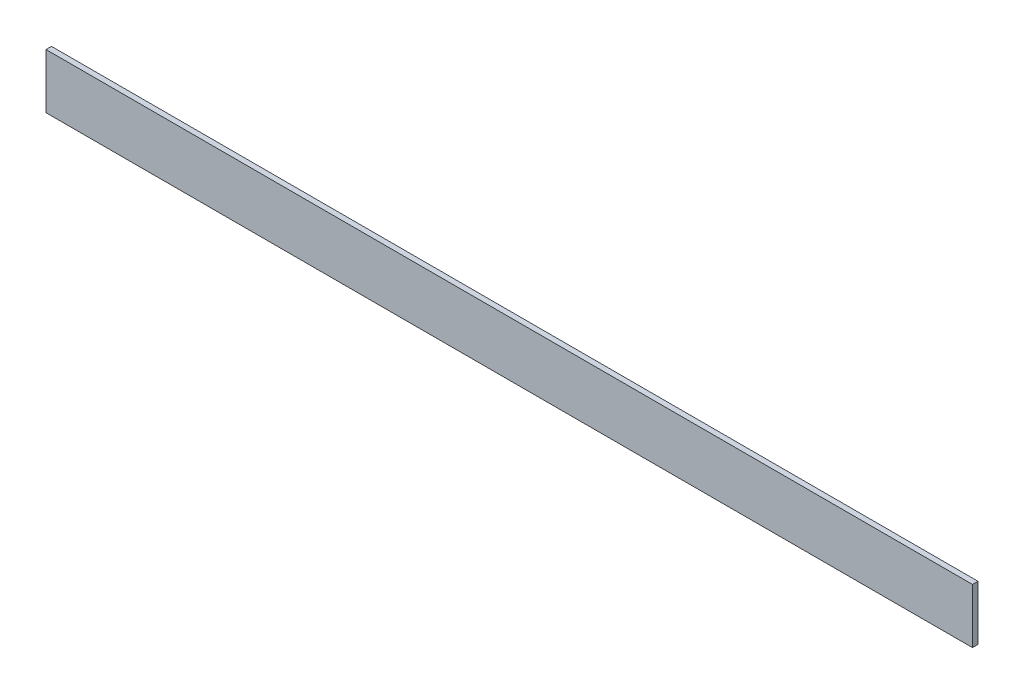
ISO-10303-21;
HEADER;
FILE_DESCRIPTION(('STEP AP214'),'2;1');
FILE_NAME('part.step','',(''),(''),'','','');
FILE_SCHEMA(('AUTOMOTIVE_DESIGN { 1 0 10303 214 1 1 1 1 }'));
ENDSEC;
DATA;
#1=APPLICATION_CONTEXT('core data for automotive mechanical design processes');
#2=APPLICATION_PROTOCOL_DEFINITION('international standard','automotive_design',2000,#1);
#3=PRODUCT_CONTEXT('',#1,'mechanical');
#4=PRODUCT('Part','Part','',(#3));
#5=PRODUCT_RELATED_PRODUCT_CATEGORY('part','',(#4));
#6=PRODUCT_DEFINITION_FORMATION('','',#4);
#7=PRODUCT_DEFINITION_CONTEXT('part definition',#1,'design');
#8=PRODUCT_DEFINITION('design','',#6,#7);
#9=PRODUCT_DEFINITION_SHAPE('','',#8);
#10=(LENGTH_UNIT() NAMED_UNIT(*) SI_UNIT(.MILLI.,.METRE.));
#11=(NAMED_UNIT(*) PLANE_ANGLE_UNIT() SI_UNIT($,.RADIAN.));
#12=(NAMED_UNIT(*) SI_UNIT($,.STERADIAN.) SOLID_ANGLE_UNIT());
#13=UNCERTAINTY_MEASURE_WITH_UNIT(LENGTH_MEASURE(1.E-05),#10,'distance_accuracy_value','');
#14=(GEOMETRIC_REPRESENTATION_CONTEXT(3) GLOBAL_UNCERTAINTY_ASSIGNED_CONTEXT((#13)) GLOBAL_UNIT_ASSIGNED_CONTEXT((#10,
#11,#12)) REPRESENTATION_CONTEXT('',''));
#15=CARTESIAN_POINT('',(0.,0.,0.));
#16=DIRECTION('',(0.,0.,1.));
#17=DIRECTION('',(1.,0.,0.));
#18=AXIS2_PLACEMENT_3D('',#15,#16,#17);
#19=CARTESIAN_POINT('',(0.,0.,1.0541));
#20=DIRECTION('',(1.,0.,0.));
#21=DIRECTION('',(0.,0.,-1.));
#22=AXIS2_PLACEMENT_3D('',#19,#20,#21);
#23=PLANE('',#22);
#24=DIRECTION('',(0.,-1.,0.));
#25=VECTOR('',#24,1.);
#26=CARTESIAN_POINT('',(0.,0.,0.));
#27=LINE('',#26,#25);
#28=CARTESIAN_POINT('',(0.,10.5029,0.));
#29=VERTEX_POINT('',#28);
#30=CARTESIAN_POINT('',(0.,0.,0.));
#31=VERTEX_POINT('',#30);
#32=EDGE_CURVE('E113',#29,#31,#27,.T.);
#33=ORIENTED_EDGE('',*,*,#32,.T.);
#34=DIRECTION('',(0.,0.,-1.));
#35=VECTOR('',#34,1.);
#36=CARTESIAN_POINT('',(0.,0.,1.0541));
#37=LINE('',#36,#35);
#38=CARTESIAN_POINT('',(0.,0.,1.0541));
#39=VERTEX_POINT('',#38);
#40=EDGE_CURVE('E11',#39,#31,#37,.T.);
#41=ORIENTED_EDGE('',*,*,#40,.F.);
#42=DIRECTION('',(0.,-1.,0.));
#43=VECTOR('',#42,1.);
#44=CARTESIAN_POINT('',(0.,0.,1.0541));
#45=LINE('',#44,#43);
#46=CARTESIAN_POINT('',(0.,10.5029,1.0541));
#47=VERTEX_POINT('',#46);
#48=EDGE_CURVE('E97',#47,#39,#45,.T.);
#49=ORIENTED_EDGE('',*,*,#48,.F.);
#50=DIRECTION('',(0.,0.,-1.));
#51=VECTOR('',#50,1.);
#52=CARTESIAN_POINT('',(0.,10.5029,1.0541));
#53=LINE('',#52,#51);
#54=EDGE_CURVE('E109',#47,#29,#53,.T.);
#55=ORIENTED_EDGE('',*,*,#54,.T.);
#56=EDGE_LOOP('',(#33,#41,#49,#55));
#57=FACE_BOUND('',#56,.T.);
#58=ADVANCED_FACE('F45',(#57),#23,.F.);
#59=CARTESIAN_POINT('',(0.,0.,1.0541));
#60=DIRECTION('',(0.,1.,0.));
#61=DIRECTION('',(0.,0.,1.));
#62=AXIS2_PLACEMENT_3D('',#59,#60,#61);
#63=PLANE('',#62);
#64=DIRECTION('',(1.,0.,0.));
#65=VECTOR('',#64,1.);
#66=CARTESIAN_POINT('',(0.,0.,0.));
#67=LINE('',#66,#65);
#68=CARTESIAN_POINT('',(177.8,0.,0.));
#69=VERTEX_POINT('',#68);
#70=EDGE_CURVE('E102',#31,#69,#67,.T.);
#71=ORIENTED_EDGE('',*,*,#70,.T.);
#72=DIRECTION('',(0.,0.,-1.));
#73=VECTOR('',#72,1.);
#74=CARTESIAN_POINT('',(177.8,0.,1.0541));
#75=LINE('',#74,#73);
#76=CARTESIAN_POINT('',(177.8,0.,1.0541));
#77=VERTEX_POINT('',#76);
#78=EDGE_CURVE('E54',#77,#69,#75,.T.);
#79=ORIENTED_EDGE('',*,*,#78,.F.);
#80=DIRECTION('',(1.,0.,0.));
#81=VECTOR('',#80,1.);
#82=CARTESIAN_POINT('',(0.,0.,1.0541));
#83=LINE('',#82,#81);
#84=EDGE_CURVE('E92',#39,#77,#83,.T.);
#85=ORIENTED_EDGE('',*,*,#84,.F.);
#86=ORIENTED_EDGE('',*,*,#40,.T.);
#87=EDGE_LOOP('',(#71,#79,#85,#86));
#88=FACE_BOUND('',#87,.T.);
#89=ADVANCED_FACE('F101',(#88),#63,.F.);
#90=CARTESIAN_POINT('',(177.8,0.,1.0541));
#91=DIRECTION('',(-1.,0.,0.));
#92=DIRECTION('',(0.,0.,1.));
#93=AXIS2_PLACEMENT_3D('',#90,#91,#92);
#94=PLANE('',#93);
#95=DIRECTION('',(0.,1.,0.));
#96=VECTOR('',#95,1.);
#97=CARTESIAN_POINT('',(177.8,0.,0.));
#98=LINE('',#97,#96);
#99=CARTESIAN_POINT('',(177.8,10.5029,0.));
#100=VERTEX_POINT('',#99);
#101=EDGE_CURVE('E79',#69,#100,#98,.T.);
#102=ORIENTED_EDGE('',*,*,#101,.T.);
#103=DIRECTION('',(0.,0.,-1.));
#104=VECTOR('',#103,1.);
#105=CARTESIAN_POINT('',(177.8,10.5029,1.0541));
#106=LINE('',#105,#104);
#107=CARTESIAN_POINT('',(177.8,10.5029,1.0541));
#108=VERTEX_POINT('',#107);
#109=EDGE_CURVE('E104',#108,#100,#106,.T.);
#110=ORIENTED_EDGE('',*,*,#109,.F.);
#111=DIRECTION('',(0.,1.,0.));
#112=VECTOR('',#111,1.);
#113=CARTESIAN_POINT('',(177.8,0.,1.0541));
#114=LINE('',#113,#112);
#115=EDGE_CURVE('E95',#77,#108,#114,.T.);
#116=ORIENTED_EDGE('',*,*,#115,.F.);
#117=ORIENTED_EDGE('',*,*,#78,.T.);
#118=EDGE_LOOP('',(#102,#110,#116,#117));
#119=FACE_BOUND('',#118,.T.);
#120=ADVANCED_FACE('F105',(#119),#94,.F.);
#121=CARTESIAN_POINT('',(0.,10.5029,1.0541));
#122=DIRECTION('',(0.,-1.,0.));
#123=DIRECTION('',(0.,0.,-1.));
#124=AXIS2_PLACEMENT_3D('',#121,#122,#123);
#125=PLANE('',#124);
#126=DIRECTION('',(-1.,0.,0.));
#127=VECTOR('',#126,1.);
#128=CARTESIAN_POINT('',(0.,10.5029,0.));
#129=LINE('',#128,#127);
#130=EDGE_CURVE('E85',#100,#29,#129,.T.);
#131=ORIENTED_EDGE('',*,*,#130,.T.);
#132=ORIENTED_EDGE('',*,*,#54,.F.);
#133=DIRECTION('',(-1.,0.,0.));
#134=VECTOR('',#133,1.);
#135=CARTESIAN_POINT('',(0.,10.5029,1.0541));
#136=LINE('',#135,#134);
#137=EDGE_CURVE('E62',#108,#47,#136,.T.);
#138=ORIENTED_EDGE('',*,*,#137,.F.);
#139=ORIENTED_EDGE('',*,*,#109,.T.);
#140=EDGE_LOOP('',(#131,#132,#138,#139));
#141=FACE_BOUND('',#140,.T.);
#142=ADVANCED_FACE('F126',(#141),#125,.F.);
#143=CARTESIAN_POINT('',(0.,0.,1.0541));
#144=DIRECTION('',(0.,0.,-1.));
#145=DIRECTION('',(-1.,0.,0.));
#146=AXIS2_PLACEMENT_3D('',#143,#144,#145);
#147=PLANE('',#146);
#148=ORIENTED_EDGE('',*,*,#48,.T.);
#149=ORIENTED_EDGE('',*,*,#84,.T.);
#150=ORIENTED_EDGE('',*,*,#115,.T.);
#151=ORIENTED_EDGE('',*,*,#137,.T.);
#152=EDGE_LOOP('',(#148,#149,#150,#151));
#153=FACE_BOUND('',#152,.T.);
#154=ADVANCED_FACE('F93',(#153),#147,.F.);
#155=CARTESIAN_POINT('',(0.,0.,0.));
#156=DIRECTION('',(0.,0.,-1.));
#157=DIRECTION('',(-1.,0.,0.));
#158=AXIS2_PLACEMENT_3D('',#155,#156,#157);
#159=PLANE('',#158);
#160=ORIENTED_EDGE('',*,*,#32,.F.);
#161=ORIENTED_EDGE('',*,*,#130,.F.);
#162=ORIENTED_EDGE('',*,*,#101,.F.);
#163=ORIENTED_EDGE('',*,*,#70,.F.);
#164=EDGE_LOOP('',(#160,#161,#162,#163));
#165=FACE_BOUND('',#164,.T.);
#166=ADVANCED_FACE('F129',(#165),#159,.T.);
#167=CLOSED_SHELL('',(#58,#89,#120,#142,#154,#166));
#168=MANIFOLD_SOLID_BREP('B2',#167);
#169=ADVANCED_BREP_SHAPE_REPRESENTATION('',(#18,#168),#14);
#170=SHAPE_DEFINITION_REPRESENTATION(#9,#169);
ENDSEC;
END-ISO-10303-21;
